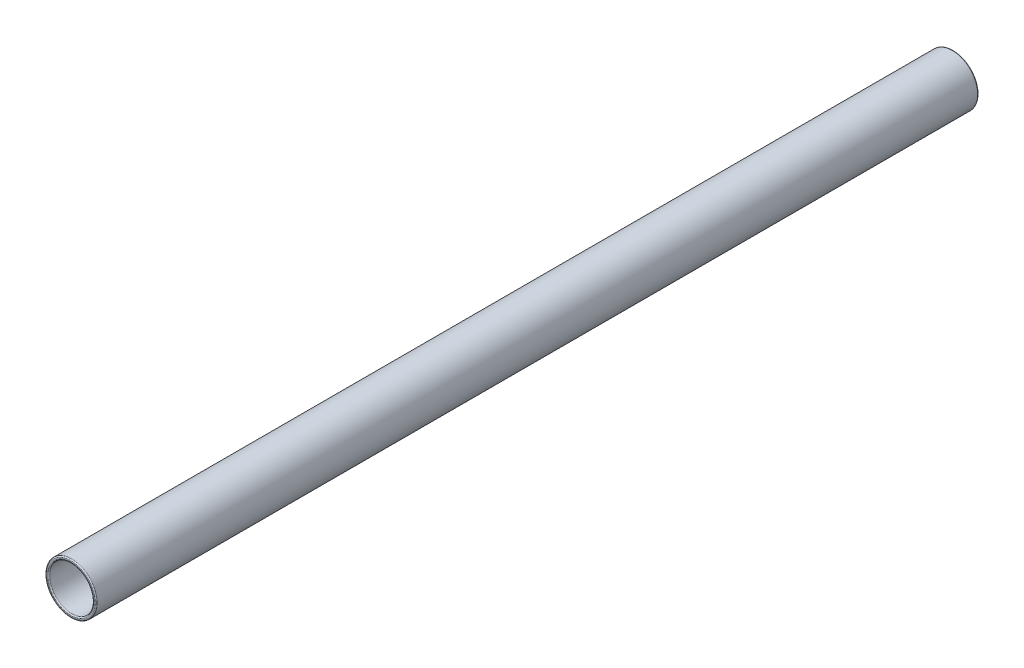
ISO-10303-21;
HEADER;
FILE_DESCRIPTION(('STEP AP214'),'2;1');
FILE_NAME('part.step','',(''),(''),'','','');
FILE_SCHEMA(('AUTOMOTIVE_DESIGN { 1 0 10303 214 1 1 1 1 }'));
ENDSEC;
DATA;
#1=APPLICATION_CONTEXT('core data for automotive mechanical design processes');
#2=APPLICATION_PROTOCOL_DEFINITION('international standard','automotive_design',2000,#1);
#3=PRODUCT_CONTEXT('',#1,'mechanical');
#4=PRODUCT('Part','Part','',(#3));
#5=PRODUCT_RELATED_PRODUCT_CATEGORY('part','',(#4));
#6=PRODUCT_DEFINITION_FORMATION('','',#4);
#7=PRODUCT_DEFINITION_CONTEXT('part definition',#1,'design');
#8=PRODUCT_DEFINITION('design','',#6,#7);
#9=PRODUCT_DEFINITION_SHAPE('','',#8);
#10=(LENGTH_UNIT() NAMED_UNIT(*) SI_UNIT(.MILLI.,.METRE.));
#11=(NAMED_UNIT(*) PLANE_ANGLE_UNIT() SI_UNIT($,.RADIAN.));
#12=(NAMED_UNIT(*) SI_UNIT($,.STERADIAN.) SOLID_ANGLE_UNIT());
#13=UNCERTAINTY_MEASURE_WITH_UNIT(LENGTH_MEASURE(1.E-05),#10,'distance_accuracy_value','');
#14=(GEOMETRIC_REPRESENTATION_CONTEXT(3) GLOBAL_UNCERTAINTY_ASSIGNED_CONTEXT((#13)) GLOBAL_UNIT_ASSIGNED_CONTEXT((#10,
#11,#12)) REPRESENTATION_CONTEXT('',''));
#15=CARTESIAN_POINT('',(0.,0.,0.));
#16=DIRECTION('',(0.,0.,1.));
#17=DIRECTION('',(1.,0.,0.));
#18=AXIS2_PLACEMENT_3D('',#15,#16,#17);
#19=CARTESIAN_POINT('',(0.,0.,200.));
#20=DIRECTION('',(0.,0.,1.));
#21=DIRECTION('',(1.,0.,0.));
#22=AXIS2_PLACEMENT_3D('',#19,#20,#21);
#23=PLANE('',#22);
#24=CARTESIAN_POINT('',(0.,0.,200.));
#25=DIRECTION('',(0.,0.,1.));
#26=DIRECTION('',(1.,0.,0.));
#27=AXIS2_PLACEMENT_3D('',#24,#25,#26);
#28=CIRCLE('',#27,10.5);
#29=CARTESIAN_POINT('',(10.5,0.,200.));
#30=VERTEX_POINT('',#29);
#31=EDGE_CURVE('E11',#30,#30,#28,.F.);
#32=ORIENTED_EDGE('',*,*,#31,.T.);
#33=EDGE_LOOP('',(#32));
#34=FACE_BOUND('',#33,.T.);
#35=CARTESIAN_POINT('',(0.,0.,200.));
#36=DIRECTION('',(0.,0.,1.));
#37=DIRECTION('',(1.,0.,0.));
#38=AXIS2_PLACEMENT_3D('',#35,#36,#37);
#39=CIRCLE('',#38,11.);
#40=CARTESIAN_POINT('',(11.,0.,200.));
#41=VERTEX_POINT('',#40);
#42=EDGE_CURVE('E57',#41,#41,#39,.T.);
#43=ORIENTED_EDGE('',*,*,#42,.T.);
#44=EDGE_LOOP('',(#43));
#45=FACE_BOUND('',#44,.T.);
#46=ADVANCED_FACE('F49',(#34,#45),#23,.T.);
#47=CARTESIAN_POINT('',(0.,0.,-200.));
#48=DIRECTION('',(0.,0.,1.));
#49=DIRECTION('',(1.,0.,0.));
#50=AXIS2_PLACEMENT_3D('',#47,#48,#49);
#51=PLANE('',#50);
#52=CARTESIAN_POINT('',(0.,0.,-200.));
#53=DIRECTION('',(0.,0.,1.));
#54=DIRECTION('',(1.,0.,0.));
#55=AXIS2_PLACEMENT_3D('',#52,#53,#54);
#56=CIRCLE('',#55,10.5);
#57=CARTESIAN_POINT('',(10.5,0.,-200.));
#58=VERTEX_POINT('',#57);
#59=EDGE_CURVE('E81',#58,#58,#56,.T.);
#60=ORIENTED_EDGE('',*,*,#59,.T.);
#61=EDGE_LOOP('',(#60));
#62=FACE_BOUND('',#61,.T.);
#63=CARTESIAN_POINT('',(0.,0.,-200.));
#64=DIRECTION('',(0.,0.,1.));
#65=DIRECTION('',(1.,0.,0.));
#66=AXIS2_PLACEMENT_3D('',#63,#64,#65);
#67=CIRCLE('',#66,11.);
#68=CARTESIAN_POINT('',(11.,0.,-200.));
#69=VERTEX_POINT('',#68);
#70=EDGE_CURVE('E85',#69,#69,#67,.F.);
#71=ORIENTED_EDGE('',*,*,#70,.T.);
#72=EDGE_LOOP('',(#71));
#73=FACE_BOUND('',#72,.T.);
#74=ADVANCED_FACE('F90',(#62,#73),#51,.F.);
#75=CARTESIAN_POINT('',(0.,0.,200.));
#76=DIRECTION('',(0.,0.,-1.));
#77=DIRECTION('',(-1.,0.,0.));
#78=AXIS2_PLACEMENT_3D('',#75,#76,#77);
#79=CYLINDRICAL_SURFACE('',#78,11.5);
#80=CARTESIAN_POINT('',(0.,0.,-199.5));
#81=DIRECTION('',(0.,0.,1.));
#82=DIRECTION('',(1.,0.,0.));
#83=AXIS2_PLACEMENT_3D('',#80,#81,#82);
#84=CIRCLE('',#83,11.5);
#85=CARTESIAN_POINT('',(11.5,0.,-199.5));
#86=VERTEX_POINT('',#85);
#87=EDGE_CURVE('E62',#86,#86,#84,.T.);
#88=ORIENTED_EDGE('',*,*,#87,.T.);
#89=EDGE_LOOP('',(#88));
#90=FACE_BOUND('',#89,.T.);
#91=CARTESIAN_POINT('',(0.,0.,199.5));
#92=DIRECTION('',(0.,0.,1.));
#93=DIRECTION('',(1.,0.,0.));
#94=AXIS2_PLACEMENT_3D('',#91,#92,#93);
#95=CIRCLE('',#94,11.5);
#96=CARTESIAN_POINT('',(11.5,0.,199.5));
#97=VERTEX_POINT('',#96);
#98=EDGE_CURVE('E67',#97,#97,#95,.F.);
#99=ORIENTED_EDGE('',*,*,#98,.T.);
#100=EDGE_LOOP('',(#99));
#101=FACE_BOUND('',#100,.T.);
#102=ADVANCED_FACE('F100',(#90,#101),#79,.T.);
#103=CARTESIAN_POINT('',(0.,0.,200.));
#104=DIRECTION('',(0.,0.,-1.));
#105=DIRECTION('',(-1.,0.,0.));
#106=AXIS2_PLACEMENT_3D('',#103,#104,#105);
#107=CYLINDRICAL_SURFACE('',#106,10.);
#108=CARTESIAN_POINT('',(0.,0.,-199.5));
#109=DIRECTION('',(0.,0.,1.));
#110=DIRECTION('',(1.,0.,0.));
#111=AXIS2_PLACEMENT_3D('',#108,#109,#110);
#112=CIRCLE('',#111,10.);
#113=CARTESIAN_POINT('',(10.,0.,-199.5));
#114=VERTEX_POINT('',#113);
#115=EDGE_CURVE('E73',#114,#114,#112,.F.);
#116=ORIENTED_EDGE('',*,*,#115,.T.);
#117=EDGE_LOOP('',(#116));
#118=FACE_BOUND('',#117,.T.);
#119=CARTESIAN_POINT('',(0.,0.,199.5));
#120=DIRECTION('',(0.,0.,1.));
#121=DIRECTION('',(1.,0.,0.));
#122=AXIS2_PLACEMENT_3D('',#119,#120,#121);
#123=CIRCLE('',#122,10.);
#124=CARTESIAN_POINT('',(10.,0.,199.5));
#125=VERTEX_POINT('',#124);
#126=EDGE_CURVE('E77',#125,#125,#123,.T.);
#127=ORIENTED_EDGE('',*,*,#126,.T.);
#128=EDGE_LOOP('',(#127));
#129=FACE_BOUND('',#128,.T.);
#130=ADVANCED_FACE('F103',(#118,#129),#107,.F.);
#131=CARTESIAN_POINT('',(0.,0.,-199.5));
#132=DIRECTION('',(0.,0.,1.));
#133=DIRECTION('',(1.,0.,0.));
#134=AXIS2_PLACEMENT_3D('',#131,#132,#133);
#135=TOROIDAL_SURFACE('',#134,10.5,0.5);
#136=ORIENTED_EDGE('',*,*,#115,.F.);
#137=EDGE_LOOP('',(#136));
#138=FACE_BOUND('',#137,.T.);
#139=ORIENTED_EDGE('',*,*,#59,.F.);
#140=EDGE_LOOP('',(#139));
#141=FACE_BOUND('',#140,.T.);
#142=ADVANCED_FACE('F96',(#138,#141),#135,.T.);
#143=CARTESIAN_POINT('',(0.,0.,-199.5));
#144=DIRECTION('',(0.,0.,1.));
#145=DIRECTION('',(1.,0.,0.));
#146=AXIS2_PLACEMENT_3D('',#143,#144,#145);
#147=TOROIDAL_SURFACE('',#146,11.,0.5);
#148=ORIENTED_EDGE('',*,*,#70,.F.);
#149=EDGE_LOOP('',(#148));
#150=FACE_BOUND('',#149,.T.);
#151=ORIENTED_EDGE('',*,*,#87,.F.);
#152=EDGE_LOOP('',(#151));
#153=FACE_BOUND('',#152,.T.);
#154=ADVANCED_FACE('F92',(#150,#153),#147,.T.);
#155=CARTESIAN_POINT('',(0.,0.,199.5));
#156=DIRECTION('',(0.,0.,1.));
#157=DIRECTION('',(1.,0.,0.));
#158=AXIS2_PLACEMENT_3D('',#155,#156,#157);
#159=TOROIDAL_SURFACE('',#158,10.5,0.5);
#160=ORIENTED_EDGE('',*,*,#31,.F.);
#161=EDGE_LOOP('',(#160));
#162=FACE_BOUND('',#161,.T.);
#163=ORIENTED_EDGE('',*,*,#126,.F.);
#164=EDGE_LOOP('',(#163));
#165=FACE_BOUND('',#164,.T.);
#166=ADVANCED_FACE('F95',(#162,#165),#159,.T.);
#167=CARTESIAN_POINT('',(0.,0.,199.5));
#168=DIRECTION('',(0.,0.,1.));
#169=DIRECTION('',(1.,0.,0.));
#170=AXIS2_PLACEMENT_3D('',#167,#168,#169);
#171=TOROIDAL_SURFACE('',#170,11.,0.5);
#172=ORIENTED_EDGE('',*,*,#98,.F.);
#173=EDGE_LOOP('',(#172));
#174=FACE_BOUND('',#173,.T.);
#175=ORIENTED_EDGE('',*,*,#42,.F.);
#176=EDGE_LOOP('',(#175));
#177=FACE_BOUND('',#176,.T.);
#178=ADVANCED_FACE('F51',(#174,#177),#171,.T.);
#179=CLOSED_SHELL('',(#46,#74,#102,#130,#142,#154,#166,#178));
#180=MANIFOLD_SOLID_BREP('B2',#179);
#181=ADVANCED_BREP_SHAPE_REPRESENTATION('',(#18,#180),#14);
#182=SHAPE_DEFINITION_REPRESENTATION(#9,#181);
ENDSEC;
END-ISO-10303-21;
